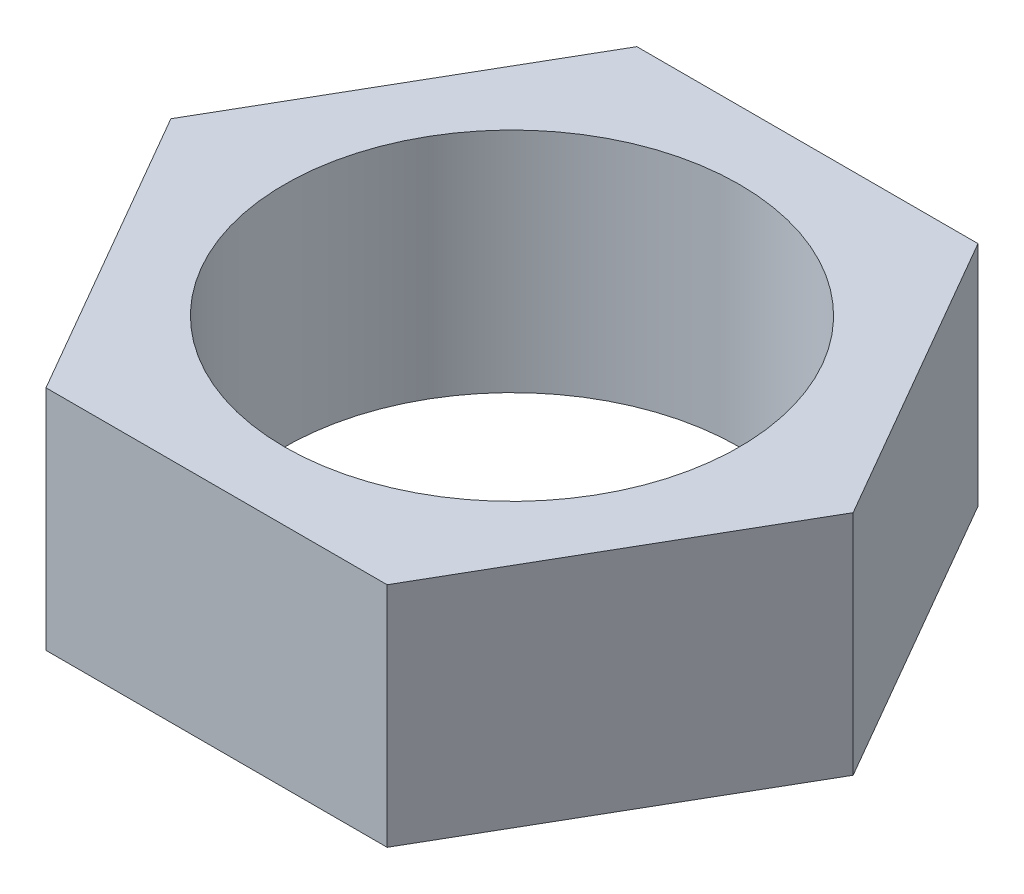
ISO-10303-21;
HEADER;
FILE_DESCRIPTION(('STEP AP214'),'2;1');
FILE_NAME('part.step','',(''),(''),'','','');
FILE_SCHEMA(('AUTOMOTIVE_DESIGN { 1 0 10303 214 1 1 1 1 }'));
ENDSEC;
DATA;
#1=APPLICATION_CONTEXT('core data for automotive mechanical design processes');
#2=APPLICATION_PROTOCOL_DEFINITION('international standard','automotive_design',2000,#1);
#3=PRODUCT_CONTEXT('',#1,'mechanical');
#4=PRODUCT('Part','Part','',(#3));
#5=PRODUCT_RELATED_PRODUCT_CATEGORY('part','',(#4));
#6=PRODUCT_DEFINITION_FORMATION('','',#4);
#7=PRODUCT_DEFINITION_CONTEXT('part definition',#1,'design');
#8=PRODUCT_DEFINITION('design','',#6,#7);
#9=PRODUCT_DEFINITION_SHAPE('','',#8);
#10=(LENGTH_UNIT() NAMED_UNIT(*) SI_UNIT(.MILLI.,.METRE.));
#11=(NAMED_UNIT(*) PLANE_ANGLE_UNIT() SI_UNIT($,.RADIAN.));
#12=(NAMED_UNIT(*) SI_UNIT($,.STERADIAN.) SOLID_ANGLE_UNIT());
#13=UNCERTAINTY_MEASURE_WITH_UNIT(LENGTH_MEASURE(1.E-05),#10,'distance_accuracy_value','');
#14=(GEOMETRIC_REPRESENTATION_CONTEXT(3) GLOBAL_UNCERTAINTY_ASSIGNED_CONTEXT((#13)) GLOBAL_UNIT_ASSIGNED_CONTEXT((#10,
#11,#12)) REPRESENTATION_CONTEXT('',''));
#15=CARTESIAN_POINT('',(0.,0.,0.));
#16=DIRECTION('',(0.,0.,1.));
#17=DIRECTION('',(1.,0.,0.));
#18=AXIS2_PLACEMENT_3D('',#15,#16,#17);
#19=CARTESIAN_POINT('',(0.,2.,0.));
#20=DIRECTION('',(0.,1.,0.));
#21=DIRECTION('',(0.,0.,1.));
#22=AXIS2_PLACEMENT_3D('',#19,#20,#21);
#23=PLANE('',#22);
#24=DIRECTION('',(-0.5,0.,-0.866025403784439));
#25=VECTOR('',#24,1.);
#26=CARTESIAN_POINT('',(3.,2.,0.));
#27=LINE('',#26,#25);
#28=CARTESIAN_POINT('',(3.,2.,0.));
#29=VERTEX_POINT('',#28);
#30=CARTESIAN_POINT('',(1.5,2.,-2.59807621135332));
#31=VERTEX_POINT('',#30);
#32=EDGE_CURVE('E134',#29,#31,#27,.T.);
#33=ORIENTED_EDGE('',*,*,#32,.T.);
#34=DIRECTION('',(-1.,0.,0.));
#35=VECTOR('',#34,1.);
#36=CARTESIAN_POINT('',(1.5,2.,-2.59807621135332));
#37=LINE('',#36,#35);
#38=CARTESIAN_POINT('',(-1.5,2.,-2.59807621135332));
#39=VERTEX_POINT('',#38);
#40=EDGE_CURVE('E92',#31,#39,#37,.T.);
#41=ORIENTED_EDGE('',*,*,#40,.T.);
#42=DIRECTION('',(-0.499999999999999,0.,0.866025403784439));
#43=VECTOR('',#42,1.);
#44=CARTESIAN_POINT('',(-1.5,2.,-2.59807621135332));
#45=LINE('',#44,#43);
#46=CARTESIAN_POINT('',(-3.,2.,0.));
#47=VERTEX_POINT('',#46);
#48=EDGE_CURVE('E105',#39,#47,#45,.T.);
#49=ORIENTED_EDGE('',*,*,#48,.T.);
#50=DIRECTION('',(0.5,0.,0.866025403784438));
#51=VECTOR('',#50,1.);
#52=CARTESIAN_POINT('',(-3.,2.,0.));
#53=LINE('',#52,#51);
#54=CARTESIAN_POINT('',(-1.5,2.,2.59807621135332));
#55=VERTEX_POINT('',#54);
#56=EDGE_CURVE('E99',#47,#55,#53,.T.);
#57=ORIENTED_EDGE('',*,*,#56,.T.);
#58=DIRECTION('',(1.,0.,0.));
#59=VECTOR('',#58,1.);
#60=CARTESIAN_POINT('',(-1.5,2.,2.59807621135332));
#61=LINE('',#60,#59);
#62=CARTESIAN_POINT('',(1.5,2.,2.59807621135332));
#63=VERTEX_POINT('',#62);
#64=EDGE_CURVE('E103',#55,#63,#61,.T.);
#65=ORIENTED_EDGE('',*,*,#64,.T.);
#66=DIRECTION('',(0.5,0.,-0.866025403784439));
#67=VECTOR('',#66,1.);
#68=CARTESIAN_POINT('',(1.5,2.,2.59807621135332));
#69=LINE('',#68,#67);
#70=EDGE_CURVE('E55',#63,#29,#69,.T.);
#71=ORIENTED_EDGE('',*,*,#70,.T.);
#72=EDGE_LOOP('',(#33,#41,#49,#57,#65,#71));
#73=FACE_BOUND('',#72,.T.);
#74=CARTESIAN_POINT('',(0.,2.,0.));
#75=DIRECTION('',(0.,1.,0.));
#76=DIRECTION('',(0.,0.,1.));
#77=AXIS2_PLACEMENT_3D('',#74,#75,#76);
#78=CIRCLE('',#77,2.);
#79=CARTESIAN_POINT('',(0.,2.,2.));
#80=VERTEX_POINT('',#79);
#81=EDGE_CURVE('E127',#80,#80,#78,.T.);
#82=ORIENTED_EDGE('',*,*,#81,.F.);
#83=EDGE_LOOP('',(#82));
#84=FACE_BOUND('',#83,.T.);
#85=ADVANCED_FACE('F38',(#73,#84),#23,.T.);
#86=CARTESIAN_POINT('',(0.,0.,0.));
#87=DIRECTION('',(0.,1.,0.));
#88=DIRECTION('',(0.,0.,1.));
#89=AXIS2_PLACEMENT_3D('',#86,#87,#88);
#90=PLANE('',#89);
#91=DIRECTION('',(-0.5,0.,-0.866025403784439));
#92=VECTOR('',#91,1.);
#93=CARTESIAN_POINT('',(3.,0.,0.));
#94=LINE('',#93,#92);
#95=CARTESIAN_POINT('',(3.,0.,0.));
#96=VERTEX_POINT('',#95);
#97=CARTESIAN_POINT('',(1.5,0.,-2.59807621135332));
#98=VERTEX_POINT('',#97);
#99=EDGE_CURVE('E123',#96,#98,#94,.T.);
#100=ORIENTED_EDGE('',*,*,#99,.F.);
#101=DIRECTION('',(0.5,0.,-0.866025403784439));
#102=VECTOR('',#101,1.);
#103=CARTESIAN_POINT('',(1.5,0.,2.59807621135332));
#104=LINE('',#103,#102);
#105=CARTESIAN_POINT('',(1.5,0.,2.59807621135332));
#106=VERTEX_POINT('',#105);
#107=EDGE_CURVE('E84',#106,#96,#104,.T.);
#108=ORIENTED_EDGE('',*,*,#107,.F.);
#109=DIRECTION('',(1.,0.,0.));
#110=VECTOR('',#109,1.);
#111=CARTESIAN_POINT('',(-1.5,0.,2.59807621135332));
#112=LINE('',#111,#110);
#113=CARTESIAN_POINT('',(-1.5,0.,2.59807621135332));
#114=VERTEX_POINT('',#113);
#115=EDGE_CURVE('E78',#114,#106,#112,.T.);
#116=ORIENTED_EDGE('',*,*,#115,.F.);
#117=DIRECTION('',(0.5,0.,0.866025403784438));
#118=VECTOR('',#117,1.);
#119=CARTESIAN_POINT('',(-3.,0.,0.));
#120=LINE('',#119,#118);
#121=CARTESIAN_POINT('',(-3.,0.,0.));
#122=VERTEX_POINT('',#121);
#123=EDGE_CURVE('E113',#122,#114,#120,.T.);
#124=ORIENTED_EDGE('',*,*,#123,.F.);
#125=DIRECTION('',(-0.499999999999999,0.,0.866025403784439));
#126=VECTOR('',#125,1.);
#127=CARTESIAN_POINT('',(-1.5,0.,-2.59807621135332));
#128=LINE('',#127,#126);
#129=CARTESIAN_POINT('',(-1.5,0.,-2.59807621135332));
#130=VERTEX_POINT('',#129);
#131=EDGE_CURVE('E129',#130,#122,#128,.T.);
#132=ORIENTED_EDGE('',*,*,#131,.F.);
#133=DIRECTION('',(-1.,0.,0.));
#134=VECTOR('',#133,1.);
#135=CARTESIAN_POINT('',(1.5,0.,-2.59807621135332));
#136=LINE('',#135,#134);
#137=EDGE_CURVE('E126',#98,#130,#136,.T.);
#138=ORIENTED_EDGE('',*,*,#137,.F.);
#139=EDGE_LOOP('',(#100,#108,#116,#124,#132,#138));
#140=FACE_BOUND('',#139,.T.);
#141=CARTESIAN_POINT('',(0.,0.,0.));
#142=DIRECTION('',(0.,1.,0.));
#143=DIRECTION('',(0.,0.,1.));
#144=AXIS2_PLACEMENT_3D('',#141,#142,#143);
#145=CIRCLE('',#144,2.);
#146=CARTESIAN_POINT('',(0.,0.,2.));
#147=VERTEX_POINT('',#146);
#148=EDGE_CURVE('E245',#147,#147,#145,.T.);
#149=ORIENTED_EDGE('',*,*,#148,.T.);
#150=EDGE_LOOP('',(#149));
#151=FACE_BOUND('',#150,.T.);
#152=ADVANCED_FACE('F143',(#140,#151),#90,.F.);
#153=CARTESIAN_POINT('',(3.,2.,0.));
#154=DIRECTION('',(-0.866025403784439,0.,0.5));
#155=DIRECTION('',(0.5,0.,0.866025403784439));
#156=AXIS2_PLACEMENT_3D('',#153,#154,#155);
#157=PLANE('',#156);
#158=ORIENTED_EDGE('',*,*,#99,.T.);
#159=DIRECTION('',(0.,-1.,0.));
#160=VECTOR('',#159,1.);
#161=CARTESIAN_POINT('',(1.5,2.,-2.59807621135332));
#162=LINE('',#161,#160);
#163=EDGE_CURVE('E11',#31,#98,#162,.T.);
#164=ORIENTED_EDGE('',*,*,#163,.F.);
#165=ORIENTED_EDGE('',*,*,#32,.F.);
#166=DIRECTION('',(0.,-1.,0.));
#167=VECTOR('',#166,1.);
#168=CARTESIAN_POINT('',(3.,2.,0.));
#169=LINE('',#168,#167);
#170=EDGE_CURVE('E119',#29,#96,#169,.T.);
#171=ORIENTED_EDGE('',*,*,#170,.T.);
#172=EDGE_LOOP('',(#158,#164,#165,#171));
#173=FACE_BOUND('',#172,.T.);
#174=ADVANCED_FACE('F40',(#173),#157,.F.);
#175=CARTESIAN_POINT('',(1.5,2.,-2.59807621135332));
#176=DIRECTION('',(0.,0.,1.));
#177=DIRECTION('',(1.,0.,0.));
#178=AXIS2_PLACEMENT_3D('',#175,#176,#177);
#179=PLANE('',#178);
#180=ORIENTED_EDGE('',*,*,#137,.T.);
#181=DIRECTION('',(0.,-1.,0.));
#182=VECTOR('',#181,1.);
#183=CARTESIAN_POINT('',(-1.5,2.,-2.59807621135332));
#184=LINE('',#183,#182);
#185=EDGE_CURVE('E47',#39,#130,#184,.T.);
#186=ORIENTED_EDGE('',*,*,#185,.F.);
#187=ORIENTED_EDGE('',*,*,#40,.F.);
#188=ORIENTED_EDGE('',*,*,#163,.T.);
#189=EDGE_LOOP('',(#180,#186,#187,#188));
#190=FACE_BOUND('',#189,.T.);
#191=ADVANCED_FACE('F168',(#190),#179,.F.);
#192=CARTESIAN_POINT('',(-1.5,2.,-2.59807621135332));
#193=DIRECTION('',(0.866025403784439,0.,0.499999999999999));
#194=DIRECTION('',(0.499999999999999,0.,-0.866025403784439));
#195=AXIS2_PLACEMENT_3D('',#192,#193,#194);
#196=PLANE('',#195);
#197=ORIENTED_EDGE('',*,*,#131,.T.);
#198=DIRECTION('',(0.,-1.,0.));
#199=VECTOR('',#198,1.);
#200=CARTESIAN_POINT('',(-3.,2.,0.));
#201=LINE('',#200,#199);
#202=EDGE_CURVE('E114',#47,#122,#201,.T.);
#203=ORIENTED_EDGE('',*,*,#202,.F.);
#204=ORIENTED_EDGE('',*,*,#48,.F.);
#205=ORIENTED_EDGE('',*,*,#185,.T.);
#206=EDGE_LOOP('',(#197,#203,#204,#205));
#207=FACE_BOUND('',#206,.T.);
#208=ADVANCED_FACE('F140',(#207),#196,.F.);
#209=CARTESIAN_POINT('',(-3.,2.,0.));
#210=DIRECTION('',(0.866025403784438,0.,-0.500000000000001));
#211=DIRECTION('',(-0.500000000000001,0.,-0.866025403784438));
#212=AXIS2_PLACEMENT_3D('',#209,#210,#211);
#213=PLANE('',#212);
#214=ORIENTED_EDGE('',*,*,#123,.T.);
#215=DIRECTION('',(0.,-1.,0.));
#216=VECTOR('',#215,1.);
#217=CARTESIAN_POINT('',(-1.5,2.,2.59807621135332));
#218=LINE('',#217,#216);
#219=EDGE_CURVE('E110',#55,#114,#218,.T.);
#220=ORIENTED_EDGE('',*,*,#219,.F.);
#221=ORIENTED_EDGE('',*,*,#56,.F.);
#222=ORIENTED_EDGE('',*,*,#202,.T.);
#223=EDGE_LOOP('',(#214,#220,#221,#222));
#224=FACE_BOUND('',#223,.T.);
#225=ADVANCED_FACE('F111',(#224),#213,.F.);
#226=CARTESIAN_POINT('',(-1.5,2.,2.59807621135332));
#227=DIRECTION('',(0.,0.,-1.));
#228=DIRECTION('',(-1.,0.,0.));
#229=AXIS2_PLACEMENT_3D('',#226,#227,#228);
#230=PLANE('',#229);
#231=ORIENTED_EDGE('',*,*,#115,.T.);
#232=DIRECTION('',(0.,-1.,0.));
#233=VECTOR('',#232,1.);
#234=CARTESIAN_POINT('',(1.5,2.,2.59807621135332));
#235=LINE('',#234,#233);
#236=EDGE_CURVE('E115',#63,#106,#235,.T.);
#237=ORIENTED_EDGE('',*,*,#236,.F.);
#238=ORIENTED_EDGE('',*,*,#64,.F.);
#239=ORIENTED_EDGE('',*,*,#219,.T.);
#240=EDGE_LOOP('',(#231,#237,#238,#239));
#241=FACE_BOUND('',#240,.T.);
#242=ADVANCED_FACE('F117',(#241),#230,.F.);
#243=CARTESIAN_POINT('',(1.5,2.,2.59807621135332));
#244=DIRECTION('',(-0.866025403784439,0.,-0.5));
#245=DIRECTION('',(-0.5,0.,0.866025403784439));
#246=AXIS2_PLACEMENT_3D('',#243,#244,#245);
#247=PLANE('',#246);
#248=ORIENTED_EDGE('',*,*,#107,.T.);
#249=ORIENTED_EDGE('',*,*,#170,.F.);
#250=ORIENTED_EDGE('',*,*,#70,.F.);
#251=ORIENTED_EDGE('',*,*,#236,.T.);
#252=EDGE_LOOP('',(#248,#249,#250,#251));
#253=FACE_BOUND('',#252,.T.);
#254=ADVANCED_FACE('F148',(#253),#247,.F.);
#255=CARTESIAN_POINT('',(0.,2.,0.));
#256=DIRECTION('',(0.,-1.,0.));
#257=DIRECTION('',(0.,0.,-1.));
#258=AXIS2_PLACEMENT_3D('',#255,#256,#257);
#259=CYLINDRICAL_SURFACE('',#258,2.);
#260=ORIENTED_EDGE('',*,*,#81,.T.);
#261=EDGE_LOOP('',(#260));
#262=FACE_BOUND('',#261,.T.);
#263=ORIENTED_EDGE('',*,*,#148,.F.);
#264=EDGE_LOOP('',(#263));
#265=FACE_BOUND('',#264,.T.);
#266=ADVANCED_FACE('F150',(#262,#265),#259,.F.);
#267=CLOSED_SHELL('',(#85,#152,#174,#191,#208,#225,#242,#254,#266));
#268=MANIFOLD_SOLID_BREP('B2',#267);
#269=ADVANCED_BREP_SHAPE_REPRESENTATION('',(#18,#268),#14);
#270=SHAPE_DEFINITION_REPRESENTATION(#9,#269);
ENDSEC;
END-ISO-10303-21;
